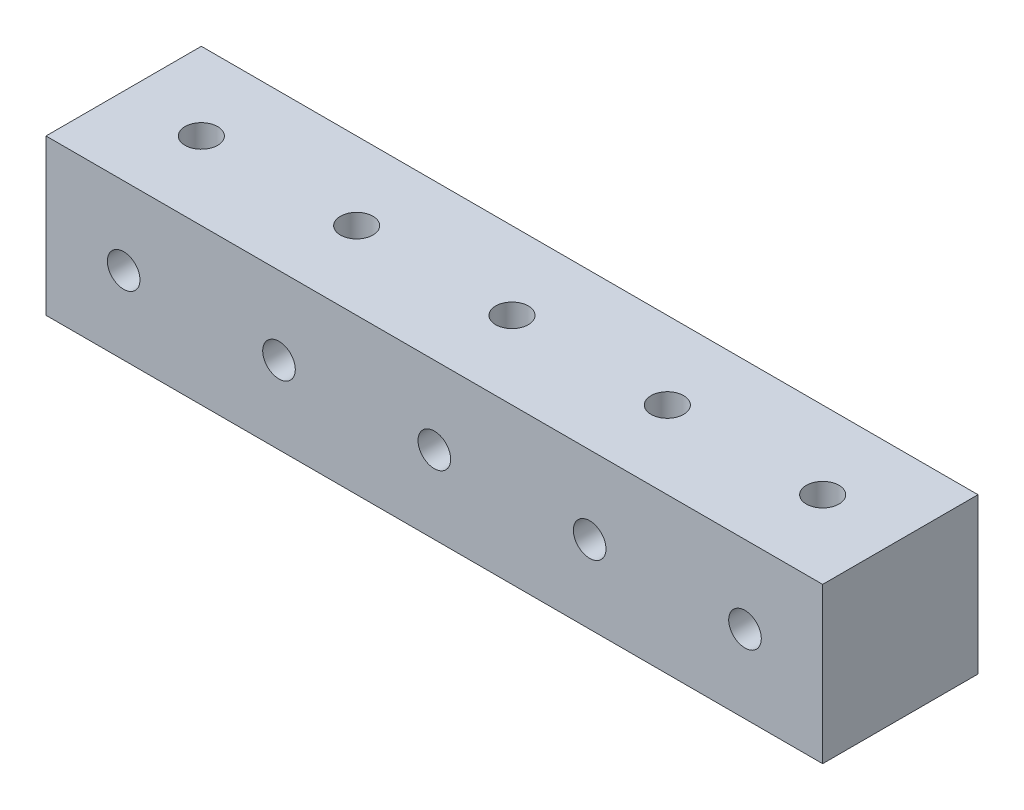
ISO-10303-21;
HEADER;
FILE_DESCRIPTION(('STEP AP214'),'2;1');
FILE_NAME('part.step','',(''),(''),'','','');
FILE_SCHEMA(('AUTOMOTIVE_DESIGN { 1 0 10303 214 1 1 1 1 }'));
ENDSEC;
DATA;
#1=APPLICATION_CONTEXT('core data for automotive mechanical design processes');
#2=APPLICATION_PROTOCOL_DEFINITION('international standard','automotive_design',2000,#1);
#3=PRODUCT_CONTEXT('',#1,'mechanical');
#4=PRODUCT('Part','Part','',(#3));
#5=PRODUCT_RELATED_PRODUCT_CATEGORY('part','',(#4));
#6=PRODUCT_DEFINITION_FORMATION('','',#4);
#7=PRODUCT_DEFINITION_CONTEXT('part definition',#1,'design');
#8=PRODUCT_DEFINITION('design','',#6,#7);
#9=PRODUCT_DEFINITION_SHAPE('','',#8);
#10=(LENGTH_UNIT() NAMED_UNIT(*) SI_UNIT(.MILLI.,.METRE.));
#11=(NAMED_UNIT(*) PLANE_ANGLE_UNIT() SI_UNIT($,.RADIAN.));
#12=(NAMED_UNIT(*) SI_UNIT($,.STERADIAN.) SOLID_ANGLE_UNIT());
#13=UNCERTAINTY_MEASURE_WITH_UNIT(LENGTH_MEASURE(1.E-05),#10,'distance_accuracy_value','');
#14=(GEOMETRIC_REPRESENTATION_CONTEXT(3) GLOBAL_UNCERTAINTY_ASSIGNED_CONTEXT((#13)) GLOBAL_UNIT_ASSIGNED_CONTEXT((#10,
#11,#12)) REPRESENTATION_CONTEXT('',''));
#15=CARTESIAN_POINT('',(0.,0.,0.));
#16=DIRECTION('',(0.,0.,1.));
#17=DIRECTION('',(1.,0.,0.));
#18=AXIS2_PLACEMENT_3D('',#15,#16,#17);
#19=CARTESIAN_POINT('',(90.,0.,-90.));
#20=DIRECTION('',(0.,0.,1.));
#21=DIRECTION('',(1.,0.,0.));
#22=AXIS2_PLACEMENT_3D('',#19,#20,#21);
#23=CYLINDRICAL_SURFACE('',#22,2.1);
#24=CARTESIAN_POINT('',(90.,0.,10.));
#25=DIRECTION('',(0.,0.,1.));
#26=DIRECTION('',(1.,0.,0.));
#27=AXIS2_PLACEMENT_3D('',#24,#25,#26);
#28=CIRCLE('',#27,2.1);
#29=CARTESIAN_POINT('',(92.1,0.,10.));
#30=VERTEX_POINT('',#29);
#31=EDGE_CURVE('E336',#30,#30,#28,.T.);
#32=ORIENTED_EDGE('',*,*,#31,.T.);
#33=EDGE_LOOP('',(#32));
#34=FACE_BOUND('',#33,.T.);
#35=CARTESIAN_POINT('',(90.,0.,0.));
#36=DIRECTION('',(0.,-0.707106781186547,0.707106781186547));
#37=DIRECTION('',(0.,0.707106781186547,0.707106781186547));
#38=AXIS2_PLACEMENT_3D('',#35,#36,#37);
#39=ELLIPSE('',#38,2.9698484809835,2.1);
#40=CARTESIAN_POINT('',(87.9,0.,0.));
#41=VERTEX_POINT('',#40);
#42=CARTESIAN_POINT('',(92.1,0.,0.));
#43=VERTEX_POINT('',#42);
#44=EDGE_CURVE('E52',#41,#43,#39,.F.);
#45=ORIENTED_EDGE('',*,*,#44,.T.);
#46=CARTESIAN_POINT('',(90.,0.,0.));
#47=DIRECTION('',(0.,0.707106781186547,0.707106781186547));
#48=DIRECTION('',(0.,-0.707106781186547,0.707106781186547));
#49=AXIS2_PLACEMENT_3D('',#46,#47,#48);
#50=ELLIPSE('',#49,2.9698484809835,2.1);
#51=EDGE_CURVE('E11',#43,#41,#50,.F.);
#52=ORIENTED_EDGE('',*,*,#51,.T.);
#53=EDGE_LOOP('',(#45,#52));
#54=FACE_BOUND('',#53,.T.);
#55=ADVANCED_FACE('F38',(#34,#54),#23,.F.);
#56=CARTESIAN_POINT('',(70.,0.,-90.));
#57=DIRECTION('',(0.,0.,1.));
#58=DIRECTION('',(1.,0.,0.));
#59=AXIS2_PLACEMENT_3D('',#56,#57,#58);
#60=CYLINDRICAL_SURFACE('',#59,2.1);
#61=CARTESIAN_POINT('',(70.,0.,10.));
#62=DIRECTION('',(0.,0.,1.));
#63=DIRECTION('',(1.,0.,0.));
#64=AXIS2_PLACEMENT_3D('',#61,#62,#63);
#65=CIRCLE('',#64,2.1);
#66=CARTESIAN_POINT('',(72.1,0.,10.));
#67=VERTEX_POINT('',#66);
#68=EDGE_CURVE('E339',#67,#67,#65,.T.);
#69=ORIENTED_EDGE('',*,*,#68,.T.);
#70=EDGE_LOOP('',(#69));
#71=FACE_BOUND('',#70,.T.);
#72=CARTESIAN_POINT('',(70.,0.,0.));
#73=DIRECTION('',(0.,-0.707106781186547,0.707106781186547));
#74=DIRECTION('',(0.,0.707106781186547,0.707106781186547));
#75=AXIS2_PLACEMENT_3D('',#72,#73,#74);
#76=ELLIPSE('',#75,2.9698484809835,2.1);
#77=CARTESIAN_POINT('',(67.9,0.,0.));
#78=VERTEX_POINT('',#77);
#79=CARTESIAN_POINT('',(72.1,0.,0.));
#80=VERTEX_POINT('',#79);
#81=EDGE_CURVE('E59',#78,#80,#76,.F.);
#82=ORIENTED_EDGE('',*,*,#81,.T.);
#83=CARTESIAN_POINT('',(70.,0.,0.));
#84=DIRECTION('',(0.,0.707106781186547,0.707106781186547));
#85=DIRECTION('',(0.,-0.707106781186547,0.707106781186547));
#86=AXIS2_PLACEMENT_3D('',#83,#84,#85);
#87=ELLIPSE('',#86,2.9698484809835,2.1);
#88=EDGE_CURVE('E177',#80,#78,#87,.F.);
#89=ORIENTED_EDGE('',*,*,#88,.T.);
#90=EDGE_LOOP('',(#82,#89));
#91=FACE_BOUND('',#90,.T.);
#92=ADVANCED_FACE('F196',(#71,#91),#60,.F.);
#93=CARTESIAN_POINT('',(50.,0.,-90.));
#94=DIRECTION('',(0.,0.,1.));
#95=DIRECTION('',(1.,0.,0.));
#96=AXIS2_PLACEMENT_3D('',#93,#94,#95);
#97=CYLINDRICAL_SURFACE('',#96,2.1);
#98=CARTESIAN_POINT('',(50.,0.,10.));
#99=DIRECTION('',(0.,0.,1.));
#100=DIRECTION('',(1.,0.,0.));
#101=AXIS2_PLACEMENT_3D('',#98,#99,#100);
#102=CIRCLE('',#101,2.1);
#103=CARTESIAN_POINT('',(52.1,0.,10.));
#104=VERTEX_POINT('',#103);
#105=EDGE_CURVE('E344',#104,#104,#102,.T.);
#106=ORIENTED_EDGE('',*,*,#105,.T.);
#107=EDGE_LOOP('',(#106));
#108=FACE_BOUND('',#107,.T.);
#109=CARTESIAN_POINT('',(50.,0.,0.));
#110=DIRECTION('',(0.,-0.707106781186547,0.707106781186547));
#111=DIRECTION('',(0.,0.707106781186547,0.707106781186547));
#112=AXIS2_PLACEMENT_3D('',#109,#110,#111);
#113=ELLIPSE('',#112,2.9698484809835,2.1);
#114=CARTESIAN_POINT('',(47.9,0.,0.));
#115=VERTEX_POINT('',#114);
#116=CARTESIAN_POINT('',(52.1,0.,0.));
#117=VERTEX_POINT('',#116);
#118=EDGE_CURVE('E152',#115,#117,#113,.F.);
#119=ORIENTED_EDGE('',*,*,#118,.T.);
#120=CARTESIAN_POINT('',(50.,0.,0.));
#121=DIRECTION('',(0.,0.707106781186547,0.707106781186547));
#122=DIRECTION('',(0.,-0.707106781186547,0.707106781186547));
#123=AXIS2_PLACEMENT_3D('',#120,#121,#122);
#124=ELLIPSE('',#123,2.9698484809835,2.1);
#125=EDGE_CURVE('E163',#117,#115,#124,.F.);
#126=ORIENTED_EDGE('',*,*,#125,.T.);
#127=EDGE_LOOP('',(#119,#126));
#128=FACE_BOUND('',#127,.T.);
#129=ADVANCED_FACE('F203',(#108,#128),#97,.F.);
#130=CARTESIAN_POINT('',(30.,0.,-90.));
#131=DIRECTION('',(0.,0.,1.));
#132=DIRECTION('',(1.,0.,0.));
#133=AXIS2_PLACEMENT_3D('',#130,#131,#132);
#134=CYLINDRICAL_SURFACE('',#133,2.1);
#135=CARTESIAN_POINT('',(30.,0.,10.));
#136=DIRECTION('',(0.,0.,1.));
#137=DIRECTION('',(1.,0.,0.));
#138=AXIS2_PLACEMENT_3D('',#135,#136,#137);
#139=CIRCLE('',#138,2.1);
#140=CARTESIAN_POINT('',(32.1,0.,10.));
#141=VERTEX_POINT('',#140);
#142=EDGE_CURVE('E348',#141,#141,#139,.T.);
#143=ORIENTED_EDGE('',*,*,#142,.T.);
#144=EDGE_LOOP('',(#143));
#145=FACE_BOUND('',#144,.T.);
#146=CARTESIAN_POINT('',(30.,0.,0.));
#147=DIRECTION('',(0.,-0.707106781186547,0.707106781186547));
#148=DIRECTION('',(0.,0.707106781186547,0.707106781186547));
#149=AXIS2_PLACEMENT_3D('',#146,#147,#148);
#150=ELLIPSE('',#149,2.9698484809835,2.1);
#151=CARTESIAN_POINT('',(27.9,0.,0.));
#152=VERTEX_POINT('',#151);
#153=CARTESIAN_POINT('',(32.1,0.,0.));
#154=VERTEX_POINT('',#153);
#155=EDGE_CURVE('E131',#152,#154,#150,.F.);
#156=ORIENTED_EDGE('',*,*,#155,.T.);
#157=CARTESIAN_POINT('',(30.,0.,0.));
#158=DIRECTION('',(0.,0.707106781186547,0.707106781186547));
#159=DIRECTION('',(0.,-0.707106781186547,0.707106781186547));
#160=AXIS2_PLACEMENT_3D('',#157,#158,#159);
#161=ELLIPSE('',#160,2.9698484809835,2.1);
#162=EDGE_CURVE('E148',#154,#152,#161,.F.);
#163=ORIENTED_EDGE('',*,*,#162,.T.);
#164=EDGE_LOOP('',(#156,#163));
#165=FACE_BOUND('',#164,.T.);
#166=ADVANCED_FACE('F419',(#145,#165),#134,.F.);
#167=CARTESIAN_POINT('',(10.,0.,-90.));
#168=DIRECTION('',(0.,0.,1.));
#169=DIRECTION('',(1.,0.,0.));
#170=AXIS2_PLACEMENT_3D('',#167,#168,#169);
#171=CYLINDRICAL_SURFACE('',#170,2.1);
#172=CARTESIAN_POINT('',(10.,0.,10.));
#173=DIRECTION('',(0.,0.,1.));
#174=DIRECTION('',(1.,0.,0.));
#175=AXIS2_PLACEMENT_3D('',#172,#173,#174);
#176=CIRCLE('',#175,2.1);
#177=CARTESIAN_POINT('',(12.1,0.,10.));
#178=VERTEX_POINT('',#177);
#179=EDGE_CURVE('E335',#178,#178,#176,.T.);
#180=ORIENTED_EDGE('',*,*,#179,.T.);
#181=EDGE_LOOP('',(#180));
#182=FACE_BOUND('',#181,.T.);
#183=CARTESIAN_POINT('',(10.,0.,0.));
#184=DIRECTION('',(0.,-0.707106781186547,0.707106781186547));
#185=DIRECTION('',(0.,0.707106781186547,0.707106781186547));
#186=AXIS2_PLACEMENT_3D('',#183,#184,#185);
#187=ELLIPSE('',#186,2.9698484809835,2.1);
#188=CARTESIAN_POINT('',(7.9,0.,0.));
#189=VERTEX_POINT('',#188);
#190=CARTESIAN_POINT('',(12.1,0.,0.));
#191=VERTEX_POINT('',#190);
#192=EDGE_CURVE('E120',#189,#191,#187,.F.);
#193=ORIENTED_EDGE('',*,*,#192,.T.);
#194=CARTESIAN_POINT('',(10.,0.,0.));
#195=DIRECTION('',(0.,0.707106781186547,0.707106781186547));
#196=DIRECTION('',(0.,-0.707106781186547,0.707106781186547));
#197=AXIS2_PLACEMENT_3D('',#194,#195,#196);
#198=ELLIPSE('',#197,2.9698484809835,2.1);
#199=EDGE_CURVE('E115',#191,#189,#198,.F.);
#200=ORIENTED_EDGE('',*,*,#199,.T.);
#201=EDGE_LOOP('',(#193,#200));
#202=FACE_BOUND('',#201,.T.);
#203=ADVANCED_FACE('F129',(#182,#202),#171,.F.);
#204=CARTESIAN_POINT('',(100.,10.,-10.));
#205=DIRECTION('',(0.,0.,1.));
#206=DIRECTION('',(0.,-1.,0.));
#207=AXIS2_PLACEMENT_3D('',#204,#205,#206);
#208=PLANE('',#207);
#209=CARTESIAN_POINT('',(10.,0.,-9.99999999999999));
#210=DIRECTION('',(0.,0.,1.));
#211=DIRECTION('',(0.,-1.,0.));
#212=AXIS2_PLACEMENT_3D('',#209,#210,#211);
#213=CIRCLE('',#212,2.1);
#214=CARTESIAN_POINT('',(10.,-2.1,-9.99999999999999));
#215=VERTEX_POINT('',#214);
#216=EDGE_CURVE('E310',#215,#215,#213,.T.);
#217=ORIENTED_EDGE('',*,*,#216,.T.);
#218=EDGE_LOOP('',(#217));
#219=FACE_BOUND('',#218,.T.);
#220=CARTESIAN_POINT('',(30.,0.,-9.99999999999999));
#221=DIRECTION('',(0.,0.,1.));
#222=DIRECTION('',(0.,-1.,0.));
#223=AXIS2_PLACEMENT_3D('',#220,#221,#222);
#224=CIRCLE('',#223,2.1);
#225=CARTESIAN_POINT('',(30.,-2.1,-9.99999999999999));
#226=VERTEX_POINT('',#225);
#227=EDGE_CURVE('E316',#226,#226,#224,.T.);
#228=ORIENTED_EDGE('',*,*,#227,.T.);
#229=EDGE_LOOP('',(#228));
#230=FACE_BOUND('',#229,.T.);
#231=CARTESIAN_POINT('',(50.,0.,-9.99999999999999));
#232=DIRECTION('',(0.,0.,1.));
#233=DIRECTION('',(0.,-1.,0.));
#234=AXIS2_PLACEMENT_3D('',#231,#232,#233);
#235=CIRCLE('',#234,2.1);
#236=CARTESIAN_POINT('',(50.,-2.1,-9.99999999999999));
#237=VERTEX_POINT('',#236);
#238=EDGE_CURVE('E320',#237,#237,#235,.T.);
#239=ORIENTED_EDGE('',*,*,#238,.T.);
#240=EDGE_LOOP('',(#239));
#241=FACE_BOUND('',#240,.T.);
#242=CARTESIAN_POINT('',(70.,0.,-9.99999999999999));
#243=DIRECTION('',(0.,0.,1.));
#244=DIRECTION('',(0.,-1.,0.));
#245=AXIS2_PLACEMENT_3D('',#242,#243,#244);
#246=CIRCLE('',#245,2.1);
#247=CARTESIAN_POINT('',(70.,-2.1,-9.99999999999999));
#248=VERTEX_POINT('',#247);
#249=EDGE_CURVE('E325',#248,#248,#246,.T.);
#250=ORIENTED_EDGE('',*,*,#249,.T.);
#251=EDGE_LOOP('',(#250));
#252=FACE_BOUND('',#251,.T.);
#253=CARTESIAN_POINT('',(90.,0.,-9.99999999999999));
#254=DIRECTION('',(0.,0.,1.));
#255=DIRECTION('',(0.,-1.,0.));
#256=AXIS2_PLACEMENT_3D('',#253,#254,#255);
#257=CIRCLE('',#256,2.1);
#258=CARTESIAN_POINT('',(90.,-2.1,-9.99999999999999));
#259=VERTEX_POINT('',#258);
#260=EDGE_CURVE('E331',#259,#259,#257,.T.);
#261=ORIENTED_EDGE('',*,*,#260,.T.);
#262=EDGE_LOOP('',(#261));
#263=FACE_BOUND('',#262,.T.);
#264=DIRECTION('',(0.,1.,0.));
#265=VECTOR('',#264,1.);
#266=CARTESIAN_POINT('',(0.,10.,-10.));
#267=LINE('',#266,#265);
#268=CARTESIAN_POINT('',(0.,-10.,-10.));
#269=VERTEX_POINT('',#268);
#270=CARTESIAN_POINT('',(0.,10.,-10.));
#271=VERTEX_POINT('',#270);
#272=EDGE_CURVE('E272',#269,#271,#267,.T.);
#273=ORIENTED_EDGE('',*,*,#272,.T.);
#274=DIRECTION('',(-1.,0.,0.));
#275=VECTOR('',#274,1.);
#276=CARTESIAN_POINT('',(100.,10.,-10.));
#277=LINE('',#276,#275);
#278=CARTESIAN_POINT('',(100.,10.,-10.));
#279=VERTEX_POINT('',#278);
#280=EDGE_CURVE('E127',#279,#271,#277,.T.);
#281=ORIENTED_EDGE('',*,*,#280,.F.);
#282=DIRECTION('',(0.,1.,0.));
#283=VECTOR('',#282,1.);
#284=CARTESIAN_POINT('',(100.,10.,-10.));
#285=LINE('',#284,#283);
#286=CARTESIAN_POINT('',(100.,-10.,-10.));
#287=VERTEX_POINT('',#286);
#288=EDGE_CURVE('E286',#287,#279,#285,.T.);
#289=ORIENTED_EDGE('',*,*,#288,.F.);
#290=DIRECTION('',(-1.,0.,0.));
#291=VECTOR('',#290,1.);
#292=CARTESIAN_POINT('',(100.,-10.,-10.));
#293=LINE('',#292,#291);
#294=EDGE_CURVE('E290',#287,#269,#293,.T.);
#295=ORIENTED_EDGE('',*,*,#294,.T.);
#296=EDGE_LOOP('',(#273,#281,#289,#295));
#297=FACE_BOUND('',#296,.T.);
#298=ADVANCED_FACE('F40',(#219,#230,#241,#252,#263,#297),#208,.F.);
#299=CARTESIAN_POINT('',(100.,10.,10.));
#300=DIRECTION('',(0.,-1.,0.));
#301=DIRECTION('',(0.,0.,-1.));
#302=AXIS2_PLACEMENT_3D('',#299,#300,#301);
#303=PLANE('',#302);
#304=CARTESIAN_POINT('',(10.,10.,0.));
#305=DIRECTION('',(0.,1.,0.));
#306=DIRECTION('',(0.,0.,1.));
#307=AXIS2_PLACEMENT_3D('',#304,#305,#306);
#308=CIRCLE('',#307,2.1);
#309=CARTESIAN_POINT('',(10.,10.,2.1));
#310=VERTEX_POINT('',#309);
#311=EDGE_CURVE('E244',#310,#310,#308,.T.);
#312=ORIENTED_EDGE('',*,*,#311,.F.);
#313=EDGE_LOOP('',(#312));
#314=FACE_BOUND('',#313,.T.);
#315=CARTESIAN_POINT('',(30.,10.,0.));
#316=DIRECTION('',(0.,1.,0.));
#317=DIRECTION('',(0.,0.,1.));
#318=AXIS2_PLACEMENT_3D('',#315,#316,#317);
#319=CIRCLE('',#318,2.1);
#320=CARTESIAN_POINT('',(30.,10.,2.1));
#321=VERTEX_POINT('',#320);
#322=EDGE_CURVE('E248',#321,#321,#319,.T.);
#323=ORIENTED_EDGE('',*,*,#322,.F.);
#324=EDGE_LOOP('',(#323));
#325=FACE_BOUND('',#324,.T.);
#326=CARTESIAN_POINT('',(50.,10.,0.));
#327=DIRECTION('',(0.,1.,0.));
#328=DIRECTION('',(0.,0.,1.));
#329=AXIS2_PLACEMENT_3D('',#326,#327,#328);
#330=CIRCLE('',#329,2.1);
#331=CARTESIAN_POINT('',(50.,10.,2.1));
#332=VERTEX_POINT('',#331);
#333=EDGE_CURVE('E252',#332,#332,#330,.T.);
#334=ORIENTED_EDGE('',*,*,#333,.F.);
#335=EDGE_LOOP('',(#334));
#336=FACE_BOUND('',#335,.T.);
#337=CARTESIAN_POINT('',(70.,10.,0.));
#338=DIRECTION('',(0.,1.,0.));
#339=DIRECTION('',(0.,0.,1.));
#340=AXIS2_PLACEMENT_3D('',#337,#338,#339);
#341=CIRCLE('',#340,2.1);
#342=CARTESIAN_POINT('',(70.,10.,2.1));
#343=VERTEX_POINT('',#342);
#344=EDGE_CURVE('E256',#343,#343,#341,.T.);
#345=ORIENTED_EDGE('',*,*,#344,.F.);
#346=EDGE_LOOP('',(#345));
#347=FACE_BOUND('',#346,.T.);
#348=CARTESIAN_POINT('',(90.,10.,0.));
#349=DIRECTION('',(0.,1.,0.));
#350=DIRECTION('',(0.,0.,1.));
#351=AXIS2_PLACEMENT_3D('',#348,#349,#350);
#352=CIRCLE('',#351,2.1);
#353=CARTESIAN_POINT('',(90.,10.,2.1));
#354=VERTEX_POINT('',#353);
#355=EDGE_CURVE('E260',#354,#354,#352,.T.);
#356=ORIENTED_EDGE('',*,*,#355,.F.);
#357=EDGE_LOOP('',(#356));
#358=FACE_BOUND('',#357,.T.);
#359=DIRECTION('',(0.,0.,1.));
#360=VECTOR('',#359,1.);
#361=CARTESIAN_POINT('',(0.,10.,10.));
#362=LINE('',#361,#360);
#363=CARTESIAN_POINT('',(0.,10.,10.));
#364=VERTEX_POINT('',#363);
#365=EDGE_CURVE('E263',#271,#364,#362,.T.);
#366=ORIENTED_EDGE('',*,*,#365,.T.);
#367=DIRECTION('',(-1.,0.,0.));
#368=VECTOR('',#367,1.);
#369=CARTESIAN_POINT('',(100.,10.,10.));
#370=LINE('',#369,#368);
#371=CARTESIAN_POINT('',(100.,10.,10.));
#372=VERTEX_POINT('',#371);
#373=EDGE_CURVE('E265',#372,#364,#370,.T.);
#374=ORIENTED_EDGE('',*,*,#373,.F.);
#375=DIRECTION('',(0.,0.,1.));
#376=VECTOR('',#375,1.);
#377=CARTESIAN_POINT('',(100.,10.,10.));
#378=LINE('',#377,#376);
#379=EDGE_CURVE('E302',#279,#372,#378,.T.);
#380=ORIENTED_EDGE('',*,*,#379,.F.);
#381=ORIENTED_EDGE('',*,*,#280,.T.);
#382=EDGE_LOOP('',(#366,#374,#380,#381));
#383=FACE_BOUND('',#382,.T.);
#384=ADVANCED_FACE('F232',(#314,#325,#336,#347,#358,#383),#303,.F.);
#385=CARTESIAN_POINT('',(100.,10.,10.));
#386=DIRECTION('',(0.,0.,-1.));
#387=DIRECTION('',(0.,1.,0.));
#388=AXIS2_PLACEMENT_3D('',#385,#386,#387);
#389=PLANE('',#388);
#390=ORIENTED_EDGE('',*,*,#179,.F.);
#391=EDGE_LOOP('',(#390));
#392=FACE_BOUND('',#391,.T.);
#393=ORIENTED_EDGE('',*,*,#142,.F.);
#394=EDGE_LOOP('',(#393));
#395=FACE_BOUND('',#394,.T.);
#396=ORIENTED_EDGE('',*,*,#105,.F.);
#397=EDGE_LOOP('',(#396));
#398=FACE_BOUND('',#397,.T.);
#399=ORIENTED_EDGE('',*,*,#68,.F.);
#400=EDGE_LOOP('',(#399));
#401=FACE_BOUND('',#400,.T.);
#402=ORIENTED_EDGE('',*,*,#31,.F.);
#403=EDGE_LOOP('',(#402));
#404=FACE_BOUND('',#403,.T.);
#405=DIRECTION('',(0.,-1.,0.));
#406=VECTOR('',#405,1.);
#407=CARTESIAN_POINT('',(0.,10.,10.));
#408=LINE('',#407,#406);
#409=CARTESIAN_POINT('',(0.,-10.,10.));
#410=VERTEX_POINT('',#409);
#411=EDGE_CURVE('E271',#364,#410,#408,.T.);
#412=ORIENTED_EDGE('',*,*,#411,.T.);
#413=DIRECTION('',(-1.,0.,0.));
#414=VECTOR('',#413,1.);
#415=CARTESIAN_POINT('',(100.,-10.,10.));
#416=LINE('',#415,#414);
#417=CARTESIAN_POINT('',(100.,-10.,10.));
#418=VERTEX_POINT('',#417);
#419=EDGE_CURVE('E279',#418,#410,#416,.T.);
#420=ORIENTED_EDGE('',*,*,#419,.F.);
#421=DIRECTION('',(0.,-1.,0.));
#422=VECTOR('',#421,1.);
#423=CARTESIAN_POINT('',(100.,10.,10.));
#424=LINE('',#423,#422);
#425=EDGE_CURVE('E277',#372,#418,#424,.T.);
#426=ORIENTED_EDGE('',*,*,#425,.F.);
#427=ORIENTED_EDGE('',*,*,#373,.T.);
#428=EDGE_LOOP('',(#412,#420,#426,#427));
#429=FACE_BOUND('',#428,.T.);
#430=ADVANCED_FACE('F229',(#392,#395,#398,#401,#404,#429),#389,.F.);
#431=CARTESIAN_POINT('',(100.,-10.,10.));
#432=DIRECTION('',(0.,1.,0.));
#433=DIRECTION('',(0.,0.,1.));
#434=AXIS2_PLACEMENT_3D('',#431,#432,#433);
#435=PLANE('',#434);
#436=CARTESIAN_POINT('',(10.,-10.,0.));
#437=DIRECTION('',(0.,1.,0.));
#438=DIRECTION('',(0.,0.,1.));
#439=AXIS2_PLACEMENT_3D('',#436,#437,#438);
#440=CIRCLE('',#439,2.1);
#441=CARTESIAN_POINT('',(10.,-10.,2.1));
#442=VERTEX_POINT('',#441);
#443=EDGE_CURVE('E340',#442,#442,#440,.T.);
#444=ORIENTED_EDGE('',*,*,#443,.T.);
#445=EDGE_LOOP('',(#444));
#446=FACE_BOUND('',#445,.T.);
#447=CARTESIAN_POINT('',(30.,-10.,0.));
#448=DIRECTION('',(0.,1.,0.));
#449=DIRECTION('',(0.,0.,1.));
#450=AXIS2_PLACEMENT_3D('',#447,#448,#449);
#451=CIRCLE('',#450,2.1);
#452=CARTESIAN_POINT('',(30.,-10.,2.1));
#453=VERTEX_POINT('',#452);
#454=EDGE_CURVE('E375',#453,#453,#451,.T.);
#455=ORIENTED_EDGE('',*,*,#454,.T.);
#456=EDGE_LOOP('',(#455));
#457=FACE_BOUND('',#456,.T.);
#458=CARTESIAN_POINT('',(50.,-10.,0.));
#459=DIRECTION('',(0.,1.,0.));
#460=DIRECTION('',(0.,0.,1.));
#461=AXIS2_PLACEMENT_3D('',#458,#459,#460);
#462=CIRCLE('',#461,2.1);
#463=CARTESIAN_POINT('',(50.,-10.,2.1));
#464=VERTEX_POINT('',#463);
#465=EDGE_CURVE('E369',#464,#464,#462,.T.);
#466=ORIENTED_EDGE('',*,*,#465,.T.);
#467=EDGE_LOOP('',(#466));
#468=FACE_BOUND('',#467,.T.);
#469=CARTESIAN_POINT('',(70.,-10.,0.));
#470=DIRECTION('',(0.,1.,0.));
#471=DIRECTION('',(0.,0.,1.));
#472=AXIS2_PLACEMENT_3D('',#469,#470,#471);
#473=CIRCLE('',#472,2.1);
#474=CARTESIAN_POINT('',(70.,-10.,2.1));
#475=VERTEX_POINT('',#474);
#476=EDGE_CURVE('E363',#475,#475,#473,.T.);
#477=ORIENTED_EDGE('',*,*,#476,.T.);
#478=EDGE_LOOP('',(#477));
#479=FACE_BOUND('',#478,.T.);
#480=CARTESIAN_POINT('',(90.,-10.,0.));
#481=DIRECTION('',(0.,1.,0.));
#482=DIRECTION('',(0.,0.,1.));
#483=AXIS2_PLACEMENT_3D('',#480,#481,#482);
#484=CIRCLE('',#483,2.1);
#485=CARTESIAN_POINT('',(90.,-10.,2.1));
#486=VERTEX_POINT('',#485);
#487=EDGE_CURVE('E357',#486,#486,#484,.T.);
#488=ORIENTED_EDGE('',*,*,#487,.T.);
#489=EDGE_LOOP('',(#488));
#490=FACE_BOUND('',#489,.T.);
#491=DIRECTION('',(0.,0.,-1.));
#492=VECTOR('',#491,1.);
#493=CARTESIAN_POINT('',(0.,-10.,10.));
#494=LINE('',#493,#492);
#495=EDGE_CURVE('E282',#410,#269,#494,.T.);
#496=ORIENTED_EDGE('',*,*,#495,.T.);
#497=ORIENTED_EDGE('',*,*,#294,.F.);
#498=DIRECTION('',(0.,0.,-1.));
#499=VECTOR('',#498,1.);
#500=CARTESIAN_POINT('',(100.,-10.,10.));
#501=LINE('',#500,#499);
#502=EDGE_CURVE('E294',#418,#287,#501,.T.);
#503=ORIENTED_EDGE('',*,*,#502,.F.);
#504=ORIENTED_EDGE('',*,*,#419,.T.);
#505=EDGE_LOOP('',(#496,#497,#503,#504));
#506=FACE_BOUND('',#505,.T.);
#507=ADVANCED_FACE('F224',(#446,#457,#468,#479,#490,#506),#435,.F.);
#508=CARTESIAN_POINT('',(100.,0.,0.));
#509=DIRECTION('',(1.,0.,0.));
#510=DIRECTION('',(0.,0.,-1.));
#511=AXIS2_PLACEMENT_3D('',#508,#509,#510);
#512=PLANE('',#511);
#513=ORIENTED_EDGE('',*,*,#288,.T.);
#514=ORIENTED_EDGE('',*,*,#379,.T.);
#515=ORIENTED_EDGE('',*,*,#425,.T.);
#516=ORIENTED_EDGE('',*,*,#502,.T.);
#517=EDGE_LOOP('',(#513,#514,#515,#516));
#518=FACE_BOUND('',#517,.T.);
#519=ADVANCED_FACE('F218',(#518),#512,.T.);
#520=CARTESIAN_POINT('',(0.,0.,0.));
#521=DIRECTION('',(1.,0.,0.));
#522=DIRECTION('',(0.,0.,-1.));
#523=AXIS2_PLACEMENT_3D('',#520,#521,#522);
#524=PLANE('',#523);
#525=ORIENTED_EDGE('',*,*,#272,.F.);
#526=ORIENTED_EDGE('',*,*,#495,.F.);
#527=ORIENTED_EDGE('',*,*,#411,.F.);
#528=ORIENTED_EDGE('',*,*,#365,.F.);
#529=EDGE_LOOP('',(#525,#526,#527,#528));
#530=FACE_BOUND('',#529,.T.);
#531=ADVANCED_FACE('F210',(#530),#524,.F.);
#532=CARTESIAN_POINT('',(90.,0.,0.));
#533=DIRECTION('',(0.,-0.707106781186547,0.707106781186547));
#534=DIRECTION('',(0.,0.707106781186547,0.707106781186547));
#535=AXIS2_PLACEMENT_3D('',#532,#533,#534);
#536=ELLIPSE('',#535,2.9698484809835,2.1);
#537=EDGE_CURVE('E182',#41,#43,#536,.T.);
#538=ORIENTED_EDGE('',*,*,#537,.T.);
#539=CARTESIAN_POINT('',(90.,0.,0.));
#540=DIRECTION('',(0.,0.707106781186547,0.707106781186547));
#541=DIRECTION('',(0.,-0.707106781186547,0.707106781186547));
#542=AXIS2_PLACEMENT_3D('',#539,#540,#541);
#543=ELLIPSE('',#542,2.9698484809835,2.1);
#544=EDGE_CURVE('E47',#43,#41,#543,.T.);
#545=ORIENTED_EDGE('',*,*,#544,.T.);
#546=EDGE_LOOP('',(#538,#545));
#547=FACE_BOUND('',#546,.T.);
#548=ORIENTED_EDGE('',*,*,#260,.F.);
#549=EDGE_LOOP('',(#548));
#550=FACE_BOUND('',#549,.T.);
#551=ADVANCED_FACE('F188',(#547,#550),#23,.F.);
#552=CARTESIAN_POINT('',(70.,0.,0.));
#553=DIRECTION('',(0.,-0.707106781186547,0.707106781186547));
#554=DIRECTION('',(0.,0.707106781186547,0.707106781186547));
#555=AXIS2_PLACEMENT_3D('',#552,#553,#554);
#556=ELLIPSE('',#555,2.9698484809835,2.1);
#557=EDGE_CURVE('E169',#78,#80,#556,.T.);
#558=ORIENTED_EDGE('',*,*,#557,.T.);
#559=CARTESIAN_POINT('',(70.,0.,0.));
#560=DIRECTION('',(0.,0.707106781186547,0.707106781186547));
#561=DIRECTION('',(0.,-0.707106781186547,0.707106781186547));
#562=AXIS2_PLACEMENT_3D('',#559,#560,#561);
#563=ELLIPSE('',#562,2.9698484809835,2.1);
#564=EDGE_CURVE('E173',#80,#78,#563,.T.);
#565=ORIENTED_EDGE('',*,*,#564,.T.);
#566=EDGE_LOOP('',(#558,#565));
#567=FACE_BOUND('',#566,.T.);
#568=ORIENTED_EDGE('',*,*,#249,.F.);
#569=EDGE_LOOP('',(#568));
#570=FACE_BOUND('',#569,.T.);
#571=ADVANCED_FACE('F206',(#567,#570),#60,.F.);
#572=CARTESIAN_POINT('',(50.,0.,0.));
#573=DIRECTION('',(0.,-0.707106781186547,0.707106781186547));
#574=DIRECTION('',(0.,0.707106781186547,0.707106781186547));
#575=AXIS2_PLACEMENT_3D('',#572,#573,#574);
#576=ELLIPSE('',#575,2.9698484809835,2.1);
#577=EDGE_CURVE('E155',#115,#117,#576,.T.);
#578=ORIENTED_EDGE('',*,*,#577,.T.);
#579=CARTESIAN_POINT('',(50.,0.,0.));
#580=DIRECTION('',(0.,0.707106781186547,0.707106781186547));
#581=DIRECTION('',(0.,-0.707106781186547,0.707106781186547));
#582=AXIS2_PLACEMENT_3D('',#579,#580,#581);
#583=ELLIPSE('',#582,2.9698484809835,2.1);
#584=EDGE_CURVE('E159',#117,#115,#583,.T.);
#585=ORIENTED_EDGE('',*,*,#584,.T.);
#586=EDGE_LOOP('',(#578,#585));
#587=FACE_BOUND('',#586,.T.);
#588=ORIENTED_EDGE('',*,*,#238,.F.);
#589=EDGE_LOOP('',(#588));
#590=FACE_BOUND('',#589,.T.);
#591=ADVANCED_FACE('F215',(#587,#590),#97,.F.);
#592=CARTESIAN_POINT('',(30.,0.,0.));
#593=DIRECTION('',(0.,-0.707106781186547,0.707106781186547));
#594=DIRECTION('',(0.,0.707106781186547,0.707106781186547));
#595=AXIS2_PLACEMENT_3D('',#592,#593,#594);
#596=ELLIPSE('',#595,2.9698484809835,2.1);
#597=EDGE_CURVE('E140',#152,#154,#596,.T.);
#598=ORIENTED_EDGE('',*,*,#597,.T.);
#599=CARTESIAN_POINT('',(30.,0.,0.));
#600=DIRECTION('',(0.,0.707106781186547,0.707106781186547));
#601=DIRECTION('',(0.,-0.707106781186547,0.707106781186547));
#602=AXIS2_PLACEMENT_3D('',#599,#600,#601);
#603=ELLIPSE('',#602,2.9698484809835,2.1);
#604=EDGE_CURVE('E144',#154,#152,#603,.T.);
#605=ORIENTED_EDGE('',*,*,#604,.T.);
#606=EDGE_LOOP('',(#598,#605));
#607=FACE_BOUND('',#606,.T.);
#608=ORIENTED_EDGE('',*,*,#227,.F.);
#609=EDGE_LOOP('',(#608));
#610=FACE_BOUND('',#609,.T.);
#611=ADVANCED_FACE('F415',(#607,#610),#134,.F.);
#612=CARTESIAN_POINT('',(10.,0.,0.));
#613=DIRECTION('',(0.,-0.707106781186547,0.707106781186547));
#614=DIRECTION('',(0.,0.707106781186547,0.707106781186547));
#615=AXIS2_PLACEMENT_3D('',#612,#613,#614);
#616=ELLIPSE('',#615,2.9698484809835,2.1);
#617=EDGE_CURVE('E111',#189,#191,#616,.T.);
#618=ORIENTED_EDGE('',*,*,#617,.T.);
#619=CARTESIAN_POINT('',(10.,0.,0.));
#620=DIRECTION('',(0.,0.707106781186547,0.707106781186547));
#621=DIRECTION('',(0.,-0.707106781186547,0.707106781186547));
#622=AXIS2_PLACEMENT_3D('',#619,#620,#621);
#623=ELLIPSE('',#622,2.9698484809835,2.1);
#624=EDGE_CURVE('E119',#191,#189,#623,.T.);
#625=ORIENTED_EDGE('',*,*,#624,.T.);
#626=EDGE_LOOP('',(#618,#625));
#627=FACE_BOUND('',#626,.T.);
#628=ORIENTED_EDGE('',*,*,#216,.F.);
#629=EDGE_LOOP('',(#628));
#630=FACE_BOUND('',#629,.T.);
#631=ADVANCED_FACE('F133',(#627,#630),#171,.F.);
#632=CARTESIAN_POINT('',(10.,-10.,0.));
#633=DIRECTION('',(0.,1.,0.));
#634=DIRECTION('',(0.,0.,1.));
#635=AXIS2_PLACEMENT_3D('',#632,#633,#634);
#636=CYLINDRICAL_SURFACE('',#635,2.1);
#637=ORIENTED_EDGE('',*,*,#311,.T.);
#638=EDGE_LOOP('',(#637));
#639=FACE_BOUND('',#638,.T.);
#640=ORIENTED_EDGE('',*,*,#192,.F.);
#641=ORIENTED_EDGE('',*,*,#624,.F.);
#642=EDGE_LOOP('',(#640,#641));
#643=FACE_BOUND('',#642,.T.);
#644=ADVANCED_FACE('F124',(#639,#643),#636,.F.);
#645=ORIENTED_EDGE('',*,*,#443,.F.);
#646=EDGE_LOOP('',(#645));
#647=FACE_BOUND('',#646,.T.);
#648=ORIENTED_EDGE('',*,*,#617,.F.);
#649=ORIENTED_EDGE('',*,*,#199,.F.);
#650=EDGE_LOOP('',(#648,#649));
#651=FACE_BOUND('',#650,.T.);
#652=ADVANCED_FACE('F113',(#647,#651),#636,.F.);
#653=CARTESIAN_POINT('',(30.,-10.,0.));
#654=DIRECTION('',(0.,1.,0.));
#655=DIRECTION('',(0.,0.,1.));
#656=AXIS2_PLACEMENT_3D('',#653,#654,#655);
#657=CYLINDRICAL_SURFACE('',#656,2.1);
#658=ORIENTED_EDGE('',*,*,#322,.T.);
#659=EDGE_LOOP('',(#658));
#660=FACE_BOUND('',#659,.T.);
#661=ORIENTED_EDGE('',*,*,#155,.F.);
#662=ORIENTED_EDGE('',*,*,#604,.F.);
#663=EDGE_LOOP('',(#661,#662));
#664=FACE_BOUND('',#663,.T.);
#665=ADVANCED_FACE('F387',(#660,#664),#657,.F.);
#666=ORIENTED_EDGE('',*,*,#454,.F.);
#667=EDGE_LOOP('',(#666));
#668=FACE_BOUND('',#667,.T.);
#669=ORIENTED_EDGE('',*,*,#597,.F.);
#670=ORIENTED_EDGE('',*,*,#162,.F.);
#671=EDGE_LOOP('',(#669,#670));
#672=FACE_BOUND('',#671,.T.);
#673=ADVANCED_FACE('F393',(#668,#672),#657,.F.);
#674=CARTESIAN_POINT('',(50.,-10.,0.));
#675=DIRECTION('',(0.,1.,0.));
#676=DIRECTION('',(0.,0.,1.));
#677=AXIS2_PLACEMENT_3D('',#674,#675,#676);
#678=CYLINDRICAL_SURFACE('',#677,2.1);
#679=ORIENTED_EDGE('',*,*,#333,.T.);
#680=EDGE_LOOP('',(#679));
#681=FACE_BOUND('',#680,.T.);
#682=ORIENTED_EDGE('',*,*,#118,.F.);
#683=ORIENTED_EDGE('',*,*,#584,.F.);
#684=EDGE_LOOP('',(#682,#683));
#685=FACE_BOUND('',#684,.T.);
#686=ADVANCED_FACE('F399',(#681,#685),#678,.F.);
#687=ORIENTED_EDGE('',*,*,#465,.F.);
#688=EDGE_LOOP('',(#687));
#689=FACE_BOUND('',#688,.T.);
#690=ORIENTED_EDGE('',*,*,#577,.F.);
#691=ORIENTED_EDGE('',*,*,#125,.F.);
#692=EDGE_LOOP('',(#690,#691));
#693=FACE_BOUND('',#692,.T.);
#694=ADVANCED_FACE('F401',(#689,#693),#678,.F.);
#695=CARTESIAN_POINT('',(70.,-10.,0.));
#696=DIRECTION('',(0.,1.,0.));
#697=DIRECTION('',(0.,0.,1.));
#698=AXIS2_PLACEMENT_3D('',#695,#696,#697);
#699=CYLINDRICAL_SURFACE('',#698,2.1);
#700=ORIENTED_EDGE('',*,*,#344,.T.);
#701=EDGE_LOOP('',(#700));
#702=FACE_BOUND('',#701,.T.);
#703=ORIENTED_EDGE('',*,*,#81,.F.);
#704=ORIENTED_EDGE('',*,*,#564,.F.);
#705=EDGE_LOOP('',(#703,#704));
#706=FACE_BOUND('',#705,.T.);
#707=ADVANCED_FACE('F404',(#702,#706),#699,.F.);
#708=ORIENTED_EDGE('',*,*,#476,.F.);
#709=EDGE_LOOP('',(#708));
#710=FACE_BOUND('',#709,.T.);
#711=ORIENTED_EDGE('',*,*,#557,.F.);
#712=ORIENTED_EDGE('',*,*,#88,.F.);
#713=EDGE_LOOP('',(#711,#712));
#714=FACE_BOUND('',#713,.T.);
#715=ADVANCED_FACE('F406',(#710,#714),#699,.F.);
#716=CARTESIAN_POINT('',(90.,-10.,0.));
#717=DIRECTION('',(0.,1.,0.));
#718=DIRECTION('',(0.,0.,1.));
#719=AXIS2_PLACEMENT_3D('',#716,#717,#718);
#720=CYLINDRICAL_SURFACE('',#719,2.1);
#721=ORIENTED_EDGE('',*,*,#355,.T.);
#722=EDGE_LOOP('',(#721));
#723=FACE_BOUND('',#722,.T.);
#724=ORIENTED_EDGE('',*,*,#44,.F.);
#725=ORIENTED_EDGE('',*,*,#544,.F.);
#726=EDGE_LOOP('',(#724,#725));
#727=FACE_BOUND('',#726,.T.);
#728=ADVANCED_FACE('F192',(#723,#727),#720,.F.);
#729=ORIENTED_EDGE('',*,*,#487,.F.);
#730=EDGE_LOOP('',(#729));
#731=FACE_BOUND('',#730,.T.);
#732=ORIENTED_EDGE('',*,*,#537,.F.);
#733=ORIENTED_EDGE('',*,*,#51,.F.);
#734=EDGE_LOOP('',(#732,#733));
#735=FACE_BOUND('',#734,.T.);
#736=ADVANCED_FACE('F194',(#731,#735),#720,.F.);
#737=CLOSED_SHELL('',(#55,#92,#129,#166,#203,#298,#384,#430,#507,#519,#531,#551,#571,#591,#611,
#631,#644,#652,#665,#673,#686,#694,#707,#715,#728,#736));
#738=MANIFOLD_SOLID_BREP('B2',#737);
#739=ADVANCED_BREP_SHAPE_REPRESENTATION('',(#18,#738),#14);
#740=SHAPE_DEFINITION_REPRESENTATION(#9,#739);
ENDSEC;
END-ISO-10303-21;
